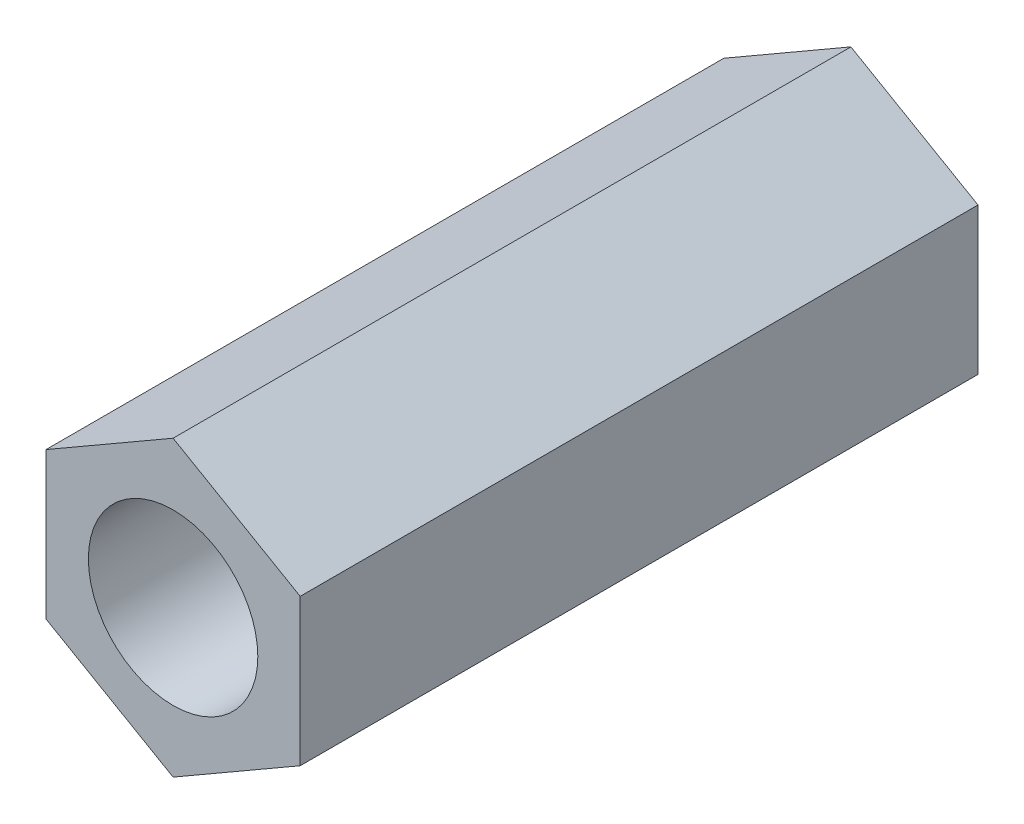
ISO-10303-21;
HEADER;
FILE_DESCRIPTION(('STEP AP214'),'2;1');
FILE_NAME('part.step','',(''),(''),'','','');
FILE_SCHEMA(('AUTOMOTIVE_DESIGN { 1 0 10303 214 1 1 1 1 }'));
ENDSEC;
DATA;
#1=APPLICATION_CONTEXT('core data for automotive mechanical design processes');
#2=APPLICATION_PROTOCOL_DEFINITION('international standard','automotive_design',2000,#1);
#3=PRODUCT_CONTEXT('',#1,'mechanical');
#4=PRODUCT('Part','Part','',(#3));
#5=PRODUCT_RELATED_PRODUCT_CATEGORY('part','',(#4));
#6=PRODUCT_DEFINITION_FORMATION('','',#4);
#7=PRODUCT_DEFINITION_CONTEXT('part definition',#1,'design');
#8=PRODUCT_DEFINITION('design','',#6,#7);
#9=PRODUCT_DEFINITION_SHAPE('','',#8);
#10=(LENGTH_UNIT() NAMED_UNIT(*) SI_UNIT(.MILLI.,.METRE.));
#11=(NAMED_UNIT(*) PLANE_ANGLE_UNIT() SI_UNIT($,.RADIAN.));
#12=(NAMED_UNIT(*) SI_UNIT($,.STERADIAN.) SOLID_ANGLE_UNIT());
#13=UNCERTAINTY_MEASURE_WITH_UNIT(LENGTH_MEASURE(1.E-05),#10,'distance_accuracy_value','');
#14=(GEOMETRIC_REPRESENTATION_CONTEXT(3) GLOBAL_UNCERTAINTY_ASSIGNED_CONTEXT((#13)) GLOBAL_UNIT_ASSIGNED_CONTEXT((#10,
#11,#12)) REPRESENTATION_CONTEXT('',''));
#15=CARTESIAN_POINT('',(0.,0.,0.));
#16=DIRECTION('',(0.,0.,1.));
#17=DIRECTION('',(1.,0.,0.));
#18=AXIS2_PLACEMENT_3D('',#15,#16,#17);
#19=CARTESIAN_POINT('',(0.,0.,76.2));
#20=DIRECTION('',(0.,0.,1.));
#21=DIRECTION('',(1.,0.,0.));
#22=AXIS2_PLACEMENT_3D('',#19,#20,#21);
#23=PLANE('',#22);
#24=DIRECTION('',(0.866025403784439,0.5,0.));
#25=VECTOR('',#24,1.);
#26=CARTESIAN_POINT('',(0.,-16.4977839420936,76.2));
#27=LINE('',#26,#25);
#28=CARTESIAN_POINT('',(0.,-16.4977839420936,76.2));
#29=VERTEX_POINT('',#28);
#30=CARTESIAN_POINT('',(14.2875,-8.24889197104677,76.2));
#31=VERTEX_POINT('',#30);
#32=EDGE_CURVE('E132',#29,#31,#27,.T.);
#33=ORIENTED_EDGE('',*,*,#32,.T.);
#34=DIRECTION('',(0.,1.,0.));
#35=VECTOR('',#34,1.);
#36=CARTESIAN_POINT('',(14.2875,-8.24889197104677,76.2));
#37=LINE('',#36,#35);
#38=CARTESIAN_POINT('',(14.2875,8.24889197104678,76.2));
#39=VERTEX_POINT('',#38);
#40=EDGE_CURVE('E90',#31,#39,#37,.T.);
#41=ORIENTED_EDGE('',*,*,#40,.T.);
#42=DIRECTION('',(-0.866025403784439,0.5,0.));
#43=VECTOR('',#42,1.);
#44=CARTESIAN_POINT('',(14.2875,8.24889197104678,76.2));
#45=LINE('',#44,#43);
#46=CARTESIAN_POINT('',(0.,16.4977839420936,76.2));
#47=VERTEX_POINT('',#46);
#48=EDGE_CURVE('E103',#39,#47,#45,.T.);
#49=ORIENTED_EDGE('',*,*,#48,.T.);
#50=DIRECTION('',(-0.866025403784439,-0.5,0.));
#51=VECTOR('',#50,1.);
#52=CARTESIAN_POINT('',(0.,16.4977839420936,76.2));
#53=LINE('',#52,#51);
#54=CARTESIAN_POINT('',(-14.2875,8.24889197104677,76.2));
#55=VERTEX_POINT('',#54);
#56=EDGE_CURVE('E97',#47,#55,#53,.T.);
#57=ORIENTED_EDGE('',*,*,#56,.T.);
#58=DIRECTION('',(0.,-1.,0.));
#59=VECTOR('',#58,1.);
#60=CARTESIAN_POINT('',(-14.2875,8.24889197104677,76.2));
#61=LINE('',#60,#59);
#62=CARTESIAN_POINT('',(-14.2875,-8.24889197104677,76.2));
#63=VERTEX_POINT('',#62);
#64=EDGE_CURVE('E101',#55,#63,#61,.T.);
#65=ORIENTED_EDGE('',*,*,#64,.T.);
#66=DIRECTION('',(0.866025403784439,-0.5,0.));
#67=VECTOR('',#66,1.);
#68=CARTESIAN_POINT('',(-14.2875,-8.24889197104677,76.2));
#69=LINE('',#68,#67);
#70=EDGE_CURVE('E53',#63,#29,#69,.T.);
#71=ORIENTED_EDGE('',*,*,#70,.T.);
#72=EDGE_LOOP('',(#33,#41,#49,#57,#65,#71));
#73=FACE_BOUND('',#72,.T.);
#74=CARTESIAN_POINT('',(0.,0.,76.2));
#75=DIRECTION('',(0.,0.,1.));
#76=DIRECTION('',(1.,0.,0.));
#77=AXIS2_PLACEMENT_3D('',#74,#75,#76);
#78=CIRCLE('',#77,9.525);
#79=CARTESIAN_POINT('',(-9.525,0.,76.2));
#80=VERTEX_POINT('',#79);
#81=EDGE_CURVE('E125',#80,#80,#78,.T.);
#82=ORIENTED_EDGE('',*,*,#81,.F.);
#83=EDGE_LOOP('',(#82));
#84=FACE_BOUND('',#83,.T.);
#85=ADVANCED_FACE('F36',(#73,#84),#23,.T.);
#86=CARTESIAN_POINT('',(0.,0.,0.));
#87=DIRECTION('',(0.,0.,1.));
#88=DIRECTION('',(1.,0.,0.));
#89=AXIS2_PLACEMENT_3D('',#86,#87,#88);
#90=PLANE('',#89);
#91=DIRECTION('',(0.866025403784439,0.5,0.));
#92=VECTOR('',#91,1.);
#93=CARTESIAN_POINT('',(0.,-16.4977839420936,0.));
#94=LINE('',#93,#92);
#95=CARTESIAN_POINT('',(0.,-16.4977839420936,0.));
#96=VERTEX_POINT('',#95);
#97=CARTESIAN_POINT('',(14.2875,-8.24889197104677,0.));
#98=VERTEX_POINT('',#97);
#99=EDGE_CURVE('E121',#96,#98,#94,.T.);
#100=ORIENTED_EDGE('',*,*,#99,.F.);
#101=DIRECTION('',(0.866025403784439,-0.5,0.));
#102=VECTOR('',#101,1.);
#103=CARTESIAN_POINT('',(-14.2875,-8.24889197104677,0.));
#104=LINE('',#103,#102);
#105=CARTESIAN_POINT('',(-14.2875,-8.24889197104677,0.));
#106=VERTEX_POINT('',#105);
#107=EDGE_CURVE('E82',#106,#96,#104,.T.);
#108=ORIENTED_EDGE('',*,*,#107,.F.);
#109=DIRECTION('',(0.,-1.,0.));
#110=VECTOR('',#109,1.);
#111=CARTESIAN_POINT('',(-14.2875,8.24889197104677,0.));
#112=LINE('',#111,#110);
#113=CARTESIAN_POINT('',(-14.2875,8.24889197104677,0.));
#114=VERTEX_POINT('',#113);
#115=EDGE_CURVE('E76',#114,#106,#112,.T.);
#116=ORIENTED_EDGE('',*,*,#115,.F.);
#117=DIRECTION('',(-0.866025403784439,-0.5,0.));
#118=VECTOR('',#117,1.);
#119=CARTESIAN_POINT('',(0.,16.4977839420936,0.));
#120=LINE('',#119,#118);
#121=CARTESIAN_POINT('',(0.,16.4977839420936,0.));
#122=VERTEX_POINT('',#121);
#123=EDGE_CURVE('E111',#122,#114,#120,.T.);
#124=ORIENTED_EDGE('',*,*,#123,.F.);
#125=DIRECTION('',(-0.866025403784439,0.5,0.));
#126=VECTOR('',#125,1.);
#127=CARTESIAN_POINT('',(14.2875,8.24889197104678,0.));
#128=LINE('',#127,#126);
#129=CARTESIAN_POINT('',(14.2875,8.24889197104678,0.));
#130=VERTEX_POINT('',#129);
#131=EDGE_CURVE('E127',#130,#122,#128,.T.);
#132=ORIENTED_EDGE('',*,*,#131,.F.);
#133=DIRECTION('',(0.,1.,0.));
#134=VECTOR('',#133,1.);
#135=CARTESIAN_POINT('',(14.2875,-8.24889197104677,0.));
#136=LINE('',#135,#134);
#137=EDGE_CURVE('E124',#98,#130,#136,.T.);
#138=ORIENTED_EDGE('',*,*,#137,.F.);
#139=EDGE_LOOP('',(#100,#108,#116,#124,#132,#138));
#140=FACE_BOUND('',#139,.T.);
#141=CARTESIAN_POINT('',(0.,0.,0.));
#142=DIRECTION('',(0.,0.,1.));
#143=DIRECTION('',(1.,0.,0.));
#144=AXIS2_PLACEMENT_3D('',#141,#142,#143);
#145=CIRCLE('',#144,9.525);
#146=CARTESIAN_POINT('',(-9.525,0.,0.));
#147=VERTEX_POINT('',#146);
#148=EDGE_CURVE('E227',#147,#147,#145,.T.);
#149=ORIENTED_EDGE('',*,*,#148,.T.);
#150=EDGE_LOOP('',(#149));
#151=FACE_BOUND('',#150,.T.);
#152=ADVANCED_FACE('F141',(#140,#151),#90,.F.);
#153=CARTESIAN_POINT('',(0.,-16.4977839420936,76.2));
#154=DIRECTION('',(-0.5,0.866025403784439,0.));
#155=DIRECTION('',(-0.866025403784438,-0.5,0.));
#156=AXIS2_PLACEMENT_3D('',#153,#154,#155);
#157=PLANE('',#156);
#158=ORIENTED_EDGE('',*,*,#99,.T.);
#159=DIRECTION('',(0.,0.,-1.));
#160=VECTOR('',#159,1.);
#161=CARTESIAN_POINT('',(14.2875,-8.24889197104677,76.2));
#162=LINE('',#161,#160);
#163=EDGE_CURVE('E11',#31,#98,#162,.T.);
#164=ORIENTED_EDGE('',*,*,#163,.F.);
#165=ORIENTED_EDGE('',*,*,#32,.F.);
#166=DIRECTION('',(0.,0.,-1.));
#167=VECTOR('',#166,1.);
#168=CARTESIAN_POINT('',(0.,-16.4977839420936,76.2));
#169=LINE('',#168,#167);
#170=EDGE_CURVE('E117',#29,#96,#169,.T.);
#171=ORIENTED_EDGE('',*,*,#170,.T.);
#172=EDGE_LOOP('',(#158,#164,#165,#171));
#173=FACE_BOUND('',#172,.T.);
#174=ADVANCED_FACE('F38',(#173),#157,.F.);
#175=CARTESIAN_POINT('',(14.2875,-8.24889197104677,76.2));
#176=DIRECTION('',(-1.,0.,0.));
#177=DIRECTION('',(0.,-1.,0.));
#178=AXIS2_PLACEMENT_3D('',#175,#176,#177);
#179=PLANE('',#178);
#180=ORIENTED_EDGE('',*,*,#137,.T.);
#181=DIRECTION('',(0.,0.,-1.));
#182=VECTOR('',#181,1.);
#183=CARTESIAN_POINT('',(14.2875,8.24889197104678,76.2));
#184=LINE('',#183,#182);
#185=EDGE_CURVE('E45',#39,#130,#184,.T.);
#186=ORIENTED_EDGE('',*,*,#185,.F.);
#187=ORIENTED_EDGE('',*,*,#40,.F.);
#188=ORIENTED_EDGE('',*,*,#163,.T.);
#189=EDGE_LOOP('',(#180,#186,#187,#188));
#190=FACE_BOUND('',#189,.T.);
#191=ADVANCED_FACE('F166',(#190),#179,.F.);
#192=CARTESIAN_POINT('',(14.2875,8.24889197104678,76.2));
#193=DIRECTION('',(-0.5,-0.866025403784439,0.));
#194=DIRECTION('',(0.866025403784439,-0.5,0.));
#195=AXIS2_PLACEMENT_3D('',#192,#193,#194);
#196=PLANE('',#195);
#197=ORIENTED_EDGE('',*,*,#131,.T.);
#198=DIRECTION('',(0.,0.,-1.));
#199=VECTOR('',#198,1.);
#200=CARTESIAN_POINT('',(0.,16.4977839420936,76.2));
#201=LINE('',#200,#199);
#202=EDGE_CURVE('E112',#47,#122,#201,.T.);
#203=ORIENTED_EDGE('',*,*,#202,.F.);
#204=ORIENTED_EDGE('',*,*,#48,.F.);
#205=ORIENTED_EDGE('',*,*,#185,.T.);
#206=EDGE_LOOP('',(#197,#203,#204,#205));
#207=FACE_BOUND('',#206,.T.);
#208=ADVANCED_FACE('F138',(#207),#196,.F.);
#209=CARTESIAN_POINT('',(0.,16.4977839420936,76.2));
#210=DIRECTION('',(0.5,-0.866025403784439,0.));
#211=DIRECTION('',(0.866025403784439,0.5,0.));
#212=AXIS2_PLACEMENT_3D('',#209,#210,#211);
#213=PLANE('',#212);
#214=ORIENTED_EDGE('',*,*,#123,.T.);
#215=DIRECTION('',(0.,0.,-1.));
#216=VECTOR('',#215,1.);
#217=CARTESIAN_POINT('',(-14.2875,8.24889197104677,76.2));
#218=LINE('',#217,#216);
#219=EDGE_CURVE('E108',#55,#114,#218,.T.);
#220=ORIENTED_EDGE('',*,*,#219,.F.);
#221=ORIENTED_EDGE('',*,*,#56,.F.);
#222=ORIENTED_EDGE('',*,*,#202,.T.);
#223=EDGE_LOOP('',(#214,#220,#221,#222));
#224=FACE_BOUND('',#223,.T.);
#225=ADVANCED_FACE('F109',(#224),#213,.F.);
#226=CARTESIAN_POINT('',(-14.2875,8.24889197104677,76.2));
#227=DIRECTION('',(1.,0.,0.));
#228=DIRECTION('',(0.,1.,0.));
#229=AXIS2_PLACEMENT_3D('',#226,#227,#228);
#230=PLANE('',#229);
#231=ORIENTED_EDGE('',*,*,#115,.T.);
#232=DIRECTION('',(0.,0.,-1.));
#233=VECTOR('',#232,1.);
#234=CARTESIAN_POINT('',(-14.2875,-8.24889197104677,76.2));
#235=LINE('',#234,#233);
#236=EDGE_CURVE('E113',#63,#106,#235,.T.);
#237=ORIENTED_EDGE('',*,*,#236,.F.);
#238=ORIENTED_EDGE('',*,*,#64,.F.);
#239=ORIENTED_EDGE('',*,*,#219,.T.);
#240=EDGE_LOOP('',(#231,#237,#238,#239));
#241=FACE_BOUND('',#240,.T.);
#242=ADVANCED_FACE('F115',(#241),#230,.F.);
#243=CARTESIAN_POINT('',(-14.2875,-8.24889197104677,76.2));
#244=DIRECTION('',(0.5,0.866025403784438,0.));
#245=DIRECTION('',(-0.866025403784438,0.5,0.));
#246=AXIS2_PLACEMENT_3D('',#243,#244,#245);
#247=PLANE('',#246);
#248=ORIENTED_EDGE('',*,*,#107,.T.);
#249=ORIENTED_EDGE('',*,*,#170,.F.);
#250=ORIENTED_EDGE('',*,*,#70,.F.);
#251=ORIENTED_EDGE('',*,*,#236,.T.);
#252=EDGE_LOOP('',(#248,#249,#250,#251));
#253=FACE_BOUND('',#252,.T.);
#254=ADVANCED_FACE('F146',(#253),#247,.F.);
#255=CARTESIAN_POINT('',(0.,0.,76.2));
#256=DIRECTION('',(0.,0.,-1.));
#257=DIRECTION('',(-1.,0.,0.));
#258=AXIS2_PLACEMENT_3D('',#255,#256,#257);
#259=CYLINDRICAL_SURFACE('',#258,9.525);
#260=CARTESIAN_POINT('',(-9.525,0.,76.2));
#261=CARTESIAN_POINT('',(-9.525,0.,75.40625));
#262=CARTESIAN_POINT('',(-9.525,0.,74.6125));
#263=CARTESIAN_POINT('',(-9.525,0.,73.025));
#264=CARTESIAN_POINT('',(-9.525,0.,72.23125));
#265=CARTESIAN_POINT('',(-9.525,0.,70.64375));
#266=CARTESIAN_POINT('',(-9.525,0.,69.85));
#267=CARTESIAN_POINT('',(-9.525,0.,68.2625));
#268=CARTESIAN_POINT('',(-9.525,0.,67.46875));
#269=CARTESIAN_POINT('',(-9.525,0.,65.88125));
#270=CARTESIAN_POINT('',(-9.525,0.,65.0875));
#271=CARTESIAN_POINT('',(-9.525,0.,63.5));
#272=CARTESIAN_POINT('',(-9.525,0.,62.70625));
#273=CARTESIAN_POINT('',(-9.525,0.,61.11875));
#274=CARTESIAN_POINT('',(-9.525,0.,60.325));
#275=CARTESIAN_POINT('',(-9.525,0.,58.7375));
#276=CARTESIAN_POINT('',(-9.525,0.,57.94375));
#277=CARTESIAN_POINT('',(-9.525,0.,56.35625));
#278=CARTESIAN_POINT('',(-9.525,0.,55.5625));
#279=CARTESIAN_POINT('',(-9.525,0.,53.975));
#280=CARTESIAN_POINT('',(-9.525,0.,53.18125));
#281=CARTESIAN_POINT('',(-9.525,0.,51.59375));
#282=CARTESIAN_POINT('',(-9.525,0.,50.8));
#283=CARTESIAN_POINT('',(-9.525,0.,49.2125));
#284=CARTESIAN_POINT('',(-9.525,0.,48.41875));
#285=CARTESIAN_POINT('',(-9.525,0.,46.83125));
#286=CARTESIAN_POINT('',(-9.525,0.,46.0375));
#287=CARTESIAN_POINT('',(-9.525,0.,44.45));
#288=CARTESIAN_POINT('',(-9.525,0.,43.65625));
#289=CARTESIAN_POINT('',(-9.525,0.,42.06875));
#290=CARTESIAN_POINT('',(-9.525,0.,41.275));
#291=CARTESIAN_POINT('',(-9.525,0.,39.6875));
#292=CARTESIAN_POINT('',(-9.525,0.,38.89375));
#293=CARTESIAN_POINT('',(-9.525,0.,37.30625));
#294=CARTESIAN_POINT('',(-9.525,0.,36.5125));
#295=CARTESIAN_POINT('',(-9.525,0.,34.925));
#296=CARTESIAN_POINT('',(-9.525,0.,34.13125));
#297=CARTESIAN_POINT('',(-9.525,0.,32.54375));
#298=CARTESIAN_POINT('',(-9.525,0.,31.75));
#299=CARTESIAN_POINT('',(-9.525,0.,30.1625));
#300=CARTESIAN_POINT('',(-9.525,0.,29.36875));
#301=CARTESIAN_POINT('',(-9.525,0.,27.78125));
#302=CARTESIAN_POINT('',(-9.525,0.,26.9875));
#303=CARTESIAN_POINT('',(-9.525,0.,25.4));
#304=CARTESIAN_POINT('',(-9.525,0.,24.60625));
#305=CARTESIAN_POINT('',(-9.525,0.,23.01875));
#306=CARTESIAN_POINT('',(-9.525,0.,22.225));
#307=CARTESIAN_POINT('',(-9.525,0.,20.6375));
#308=CARTESIAN_POINT('',(-9.525,0.,19.84375));
#309=CARTESIAN_POINT('',(-9.525,0.,18.25625));
#310=CARTESIAN_POINT('',(-9.525,0.,17.4625));
#311=CARTESIAN_POINT('',(-9.525,0.,15.875));
#312=CARTESIAN_POINT('',(-9.525,0.,15.08125));
#313=CARTESIAN_POINT('',(-9.525,0.,13.49375));
#314=CARTESIAN_POINT('',(-9.525,0.,12.7));
#315=CARTESIAN_POINT('',(-9.525,0.,11.1125));
#316=CARTESIAN_POINT('',(-9.525,0.,10.31875));
#317=CARTESIAN_POINT('',(-9.525,0.,8.73125));
#318=CARTESIAN_POINT('',(-9.525,0.,7.93750000000001));
#319=CARTESIAN_POINT('',(-9.525,0.,6.35));
#320=CARTESIAN_POINT('',(-9.525,0.,5.55625));
#321=CARTESIAN_POINT('',(-9.525,0.,3.96875));
#322=CARTESIAN_POINT('',(-9.525,0.,3.175));
#323=CARTESIAN_POINT('',(-9.525,0.,1.5875));
#324=CARTESIAN_POINT('',(-9.525,0.,0.793750000000001));
#325=CARTESIAN_POINT('',(-9.525,0.,0.));
#326=B_SPLINE_CURVE_WITH_KNOTS('',3,(#260,#261,#262,#263,#264,#265,#266,#267,#268,#269,#270,
#271,#272,#273,#274,#275,#276,#277,#278,#279,#280,#281,#282,#283,#284,#285,#286,#287,#288,#289,
#290,#291,#292,#293,#294,#295,#296,#297,#298,#299,#300,#301,#302,#303,#304,#305,#306,#307,#308,
#309,#310,#311,#312,#313,#314,#315,#316,#317,#318,#319,#320,#321,#322,#323,#324,#325),
.UNSPECIFIED.,.F.,.F.,(4,2,2,2,2,2,2,2,2,2,2,2,2,2,2,2,2,2,2,2,2,2,2,2,2,2,2,2,2,2,2,2,4),(0.,
2.38125,4.7625,7.14375,9.52500000000001,11.90625,14.2875,16.66875,19.05,21.43125,23.8125,
26.19375,28.575,30.95625,33.3375,35.71875,38.1,40.48125,42.8625,45.24375,47.625,50.00625,
52.3875,54.76875,57.15,59.53125,61.9125,64.29375,66.675,69.05625,71.4375,73.81875,76.2),.UNSPECIFIED.);
#327=EDGE_CURVE('BSEAM148',#80,#147,#326,.T.);
#328=ORIENTED_EDGE('',*,*,#81,.T.);
#329=ORIENTED_EDGE('',*,*,#148,.F.);
#330=ORIENTED_EDGE('',*,*,#327,.T.);
#331=ORIENTED_EDGE('',*,*,#327,.F.);
#332=EDGE_LOOP('',(#328,#330,#329,#331));
#333=FACE_BOUND('',#332,.T.);
#334=ADVANCED_FACE('F148',(#333),#259,.F.);
#335=CLOSED_SHELL('',(#85,#152,#174,#191,#208,#225,#242,#254,#334));
#336=MANIFOLD_SOLID_BREP('B2',#335);
#337=ADVANCED_BREP_SHAPE_REPRESENTATION('',(#18,#336),#14);
#338=SHAPE_DEFINITION_REPRESENTATION(#9,#337);
ENDSEC;
END-ISO-10303-21;
